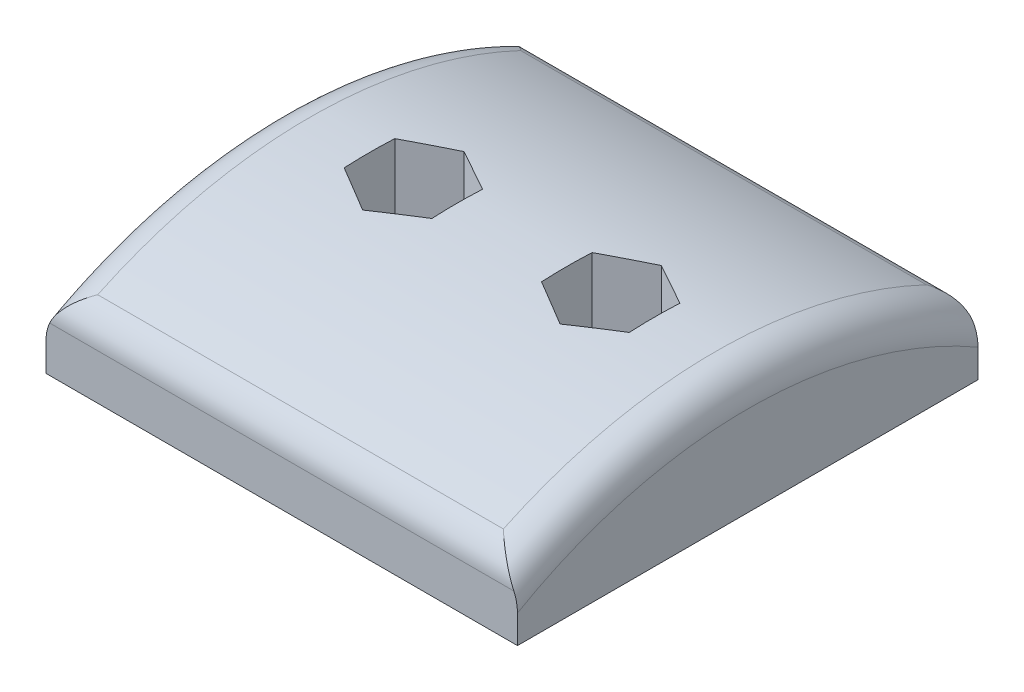
ISO-10303-21;
HEADER;
FILE_DESCRIPTION(('STEP AP214'),'2;1');
FILE_NAME('part.step','',(''),(''),'','','');
FILE_SCHEMA(('AUTOMOTIVE_DESIGN { 1 0 10303 214 1 1 1 1 }'));
ENDSEC;
DATA;
#1=APPLICATION_CONTEXT('core data for automotive mechanical design processes');
#2=APPLICATION_PROTOCOL_DEFINITION('international standard','automotive_design',2000,#1);
#3=PRODUCT_CONTEXT('',#1,'mechanical');
#4=PRODUCT('Part','Part','',(#3));
#5=PRODUCT_RELATED_PRODUCT_CATEGORY('part','',(#4));
#6=PRODUCT_DEFINITION_FORMATION('','',#4);
#7=PRODUCT_DEFINITION_CONTEXT('part definition',#1,'design');
#8=PRODUCT_DEFINITION('design','',#6,#7);
#9=PRODUCT_DEFINITION_SHAPE('','',#8);
#10=(LENGTH_UNIT() NAMED_UNIT(*) SI_UNIT(.MILLI.,.METRE.));
#11=(NAMED_UNIT(*) PLANE_ANGLE_UNIT() SI_UNIT($,.RADIAN.));
#12=(NAMED_UNIT(*) SI_UNIT($,.STERADIAN.) SOLID_ANGLE_UNIT());
#13=UNCERTAINTY_MEASURE_WITH_UNIT(LENGTH_MEASURE(1.E-05),#10,'distance_accuracy_value','');
#14=(GEOMETRIC_REPRESENTATION_CONTEXT(3) GLOBAL_UNCERTAINTY_ASSIGNED_CONTEXT((#13)) GLOBAL_UNIT_ASSIGNED_CONTEXT((#10,
#11,#12)) REPRESENTATION_CONTEXT('',''));
#15=CARTESIAN_POINT('',(0.,0.,0.));
#16=DIRECTION('',(0.,0.,1.));
#17=DIRECTION('',(1.,0.,0.));
#18=AXIS2_PLACEMENT_3D('',#15,#16,#17);
#19=CARTESIAN_POINT('',(21.5,-33.7994974842648,0.));
#20=DIRECTION('',(-1.,0.,0.));
#21=DIRECTION('',(0.,0.,1.));
#22=AXIS2_PLACEMENT_3D('',#19,#20,#21);
#23=CYLINDRICAL_SURFACE('',#22,45.);
#24=CARTESIAN_POINT('',(1.,-33.7994974842648,0.));
#25=DIRECTION('',(-0.5,0.,0.866025403784439));
#26=DIRECTION('',(-0.866025403784439,0.,-0.5));
#27=AXIS2_PLACEMENT_3D('',#24,#25,#26);
#28=ELLIPSE('',#27,90.,45.);
#29=CARTESIAN_POINT('',(9.,10.9628378733399,4.61880215351701));
#30=VERTEX_POINT('',#29);
#31=CARTESIAN_POINT('',(5.,11.1412041865666,2.3094010767585));
#32=VERTEX_POINT('',#31);
#33=EDGE_CURVE('E11',#30,#32,#28,.T.);
#34=ORIENTED_EDGE('',*,*,#33,.T.);
#35=CARTESIAN_POINT('',(5.,-33.7994974842648,0.));
#36=DIRECTION('',(-1.,0.,0.));
#37=DIRECTION('',(0.,0.,1.));
#38=AXIS2_PLACEMENT_3D('',#35,#36,#37);
#39=CIRCLE('',#38,45.);
#40=CARTESIAN_POINT('',(5.,11.1412041865666,-2.3094010767585));
#41=VERTEX_POINT('',#40);
#42=EDGE_CURVE('E176',#32,#41,#39,.T.);
#43=ORIENTED_EDGE('',*,*,#42,.T.);
#44=CARTESIAN_POINT('',(0.99999999999999,-33.7994974842648,0.));
#45=DIRECTION('',(-0.499999999999999,0.,-0.866025403784439));
#46=DIRECTION('',(-0.866025403784439,0.,0.499999999999999));
#47=AXIS2_PLACEMENT_3D('',#44,#45,#46);
#48=ELLIPSE('',#47,90.0000000000001,45.);
#49=CARTESIAN_POINT('',(9.,10.9628378733399,-4.618802153517));
#50=VERTEX_POINT('',#49);
#51=EDGE_CURVE('E353',#41,#50,#48,.T.);
#52=ORIENTED_EDGE('',*,*,#51,.T.);
#53=CARTESIAN_POINT('',(17.,-33.7994974842648,0.));
#54=DIRECTION('',(0.499999999999999,0.,-0.866025403784439));
#55=DIRECTION('',(-0.866025403784439,0.,-0.499999999999999));
#56=AXIS2_PLACEMENT_3D('',#53,#54,#55);
#57=ELLIPSE('',#56,90.0000000000001,45.);
#58=CARTESIAN_POINT('',(13.,11.1412041865666,-2.3094010767585));
#59=VERTEX_POINT('',#58);
#60=EDGE_CURVE('E356',#50,#59,#57,.T.);
#61=ORIENTED_EDGE('',*,*,#60,.T.);
#62=CARTESIAN_POINT('',(13.,-33.7994974842648,0.));
#63=DIRECTION('',(1.,0.,0.));
#64=DIRECTION('',(0.,0.,-1.));
#65=AXIS2_PLACEMENT_3D('',#62,#63,#64);
#66=CIRCLE('',#65,45.);
#67=CARTESIAN_POINT('',(13.,11.1412041865666,2.3094010767585));
#68=VERTEX_POINT('',#67);
#69=EDGE_CURVE('E359',#59,#68,#66,.T.);
#70=ORIENTED_EDGE('',*,*,#69,.T.);
#71=CARTESIAN_POINT('',(17.,-33.7994974842648,0.));
#72=DIRECTION('',(0.5,0.,0.866025403784439));
#73=DIRECTION('',(-0.866025403784439,0.,0.5));
#74=AXIS2_PLACEMENT_3D('',#71,#72,#73);
#75=ELLIPSE('',#74,90.,45.);
#76=EDGE_CURVE('E44',#68,#30,#75,.T.);
#77=ORIENTED_EDGE('',*,*,#76,.T.);
#78=EDGE_LOOP('',(#34,#43,#52,#61,#70,#77));
#79=FACE_BOUND('',#78,.T.);
#80=CARTESIAN_POINT('',(-17.,-33.7994974842648,0.));
#81=DIRECTION('',(-0.5,0.,0.866025403784439));
#82=DIRECTION('',(-0.866025403784439,0.,-0.5));
#83=AXIS2_PLACEMENT_3D('',#80,#81,#82);
#84=ELLIPSE('',#83,90.,45.);
#85=CARTESIAN_POINT('',(-9.,10.9628378733399,4.618802153517));
#86=VERTEX_POINT('',#85);
#87=CARTESIAN_POINT('',(-13.,11.1412041865666,2.3094010767585));
#88=VERTEX_POINT('',#87);
#89=EDGE_CURVE('E349',#86,#88,#84,.T.);
#90=ORIENTED_EDGE('',*,*,#89,.T.);
#91=CARTESIAN_POINT('',(-13.,-33.7994974842648,0.));
#92=DIRECTION('',(-1.,0.,0.));
#93=DIRECTION('',(0.,0.,1.));
#94=AXIS2_PLACEMENT_3D('',#91,#92,#93);
#95=CIRCLE('',#94,45.);
#96=CARTESIAN_POINT('',(-13.,11.1412041865666,-2.30940107675851));
#97=VERTEX_POINT('',#96);
#98=EDGE_CURVE('E333',#88,#97,#95,.T.);
#99=ORIENTED_EDGE('',*,*,#98,.T.);
#100=CARTESIAN_POINT('',(-17.,-33.7994974842648,0.));
#101=DIRECTION('',(-0.499999999999999,0.,-0.866025403784439));
#102=DIRECTION('',(-0.866025403784439,0.,0.499999999999999));
#103=AXIS2_PLACEMENT_3D('',#100,#101,#102);
#104=ELLIPSE('',#103,90.0000000000001,45.);
#105=CARTESIAN_POINT('',(-9.,10.9628378733399,-4.618802153517));
#106=VERTEX_POINT('',#105);
#107=EDGE_CURVE('E336',#97,#106,#104,.T.);
#108=ORIENTED_EDGE('',*,*,#107,.T.);
#109=CARTESIAN_POINT('',(-0.99999999999999,-33.7994974842648,0.));
#110=DIRECTION('',(0.5,0.,-0.866025403784439));
#111=DIRECTION('',(-0.866025403784439,0.,-0.5));
#112=AXIS2_PLACEMENT_3D('',#109,#110,#111);
#113=ELLIPSE('',#112,90.0000000000001,45.);
#114=CARTESIAN_POINT('',(-5.,11.1412041865666,-2.3094010767585));
#115=VERTEX_POINT('',#114);
#116=EDGE_CURVE('E340',#106,#115,#113,.T.);
#117=ORIENTED_EDGE('',*,*,#116,.T.);
#118=CARTESIAN_POINT('',(-5.,-33.7994974842648,0.));
#119=DIRECTION('',(1.,0.,0.));
#120=DIRECTION('',(0.,0.,-1.));
#121=AXIS2_PLACEMENT_3D('',#118,#119,#120);
#122=CIRCLE('',#121,45.);
#123=CARTESIAN_POINT('',(-5.,11.1412041865666,2.3094010767585));
#124=VERTEX_POINT('',#123);
#125=EDGE_CURVE('E343',#115,#124,#122,.T.);
#126=ORIENTED_EDGE('',*,*,#125,.T.);
#127=CARTESIAN_POINT('',(-1.,-33.7994974842648,0.));
#128=DIRECTION('',(0.5,0.,0.866025403784439));
#129=DIRECTION('',(-0.866025403784439,0.,0.5));
#130=AXIS2_PLACEMENT_3D('',#127,#128,#129);
#131=ELLIPSE('',#130,90.,45.);
#132=EDGE_CURVE('E346',#124,#86,#131,.T.);
#133=ORIENTED_EDGE('',*,*,#132,.T.);
#134=EDGE_LOOP('',(#90,#99,#108,#117,#126,#133));
#135=FACE_BOUND('',#134,.T.);
#136=CARTESIAN_POINT('',(18.5,-33.7994974842648,0.));
#137=DIRECTION('',(-1.,0.,0.));
#138=DIRECTION('',(0.,0.,1.));
#139=AXIS2_PLACEMENT_3D('',#136,#137,#138);
#140=CIRCLE('',#139,45.);
#141=CARTESIAN_POINT('',(18.5,6.8583581464715,19.2857142857143));
#142=VERTEX_POINT('',#141);
#143=CARTESIAN_POINT('',(18.5,6.8583581464715,-19.2857142857143));
#144=VERTEX_POINT('',#143);
#145=EDGE_CURVE('E272',#142,#144,#140,.T.);
#146=ORIENTED_EDGE('',*,*,#145,.T.);
#147=DIRECTION('',(-1.,0.,0.));
#148=VECTOR('',#147,1.);
#149=CARTESIAN_POINT('',(21.5,6.8583581464715,-19.2857142857143));
#150=LINE('',#149,#148);
#151=CARTESIAN_POINT('',(-18.5,6.8583581464715,-19.2857142857143));
#152=VERTEX_POINT('',#151);
#153=EDGE_CURVE('E274',#144,#152,#150,.T.);
#154=ORIENTED_EDGE('',*,*,#153,.T.);
#155=CARTESIAN_POINT('',(-18.5,-33.7994974842648,0.));
#156=DIRECTION('',(-1.,0.,0.));
#157=DIRECTION('',(0.,0.,1.));
#158=AXIS2_PLACEMENT_3D('',#155,#156,#157);
#159=CIRCLE('',#158,45.);
#160=CARTESIAN_POINT('',(-18.5,6.8583581464715,19.2857142857143));
#161=VERTEX_POINT('',#160);
#162=EDGE_CURVE('E268',#152,#161,#159,.F.);
#163=ORIENTED_EDGE('',*,*,#162,.T.);
#164=DIRECTION('',(-1.,0.,0.));
#165=VECTOR('',#164,1.);
#166=CARTESIAN_POINT('',(21.5,6.8583581464715,19.2857142857143));
#167=LINE('',#166,#165);
#168=EDGE_CURVE('E270',#161,#142,#167,.F.);
#169=ORIENTED_EDGE('',*,*,#168,.T.);
#170=EDGE_LOOP('',(#146,#154,#163,#169));
#171=FACE_BOUND('',#170,.T.);
#172=ADVANCED_FACE('F35',(#79,#135,#171),#23,.T.);
#173=CARTESIAN_POINT('',(21.5,6.,21.));
#174=DIRECTION('',(0.,0.,-1.));
#175=DIRECTION('',(-1.,0.,0.));
#176=AXIS2_PLACEMENT_3D('',#173,#174,#175);
#177=PLANE('',#176);
#178=DIRECTION('',(0.,-1.,0.));
#179=VECTOR('',#178,1.);
#180=CARTESIAN_POINT('',(21.5,6.,21.));
#181=LINE('',#180,#179);
#182=CARTESIAN_POINT('',(21.5,2.57356947468162,21.));
#183=VERTEX_POINT('',#182);
#184=CARTESIAN_POINT('',(21.5,0.,21.));
#185=VERTEX_POINT('',#184);
#186=EDGE_CURVE('E247',#183,#185,#181,.T.);
#187=ORIENTED_EDGE('',*,*,#186,.F.);
#188=CARTESIAN_POINT('',(21.5,2.57356947468162,21.));
#189=CARTESIAN_POINT('',(21.4999837214118,2.68242740250879,21.));
#190=CARTESIAN_POINT('',(21.4955518720459,2.79121056308361,21.));
#191=CARTESIAN_POINT('',(21.4777424726236,3.00814923270228,21.));
#192=CARTESIAN_POINT('',(21.464356005648,3.11630400761352,21.));
#193=CARTESIAN_POINT('',(21.4112890889158,3.43467998424908,21.));
#194=CARTESIAN_POINT('',(21.3587023326863,3.64301348052677,21.));
#195=CARTESIAN_POINT('',(21.271052064074,3.89618437613812,21.));
#196=CARTESIAN_POINT('',(21.2521994968675,3.94700561889606,21.));
#197=CARTESIAN_POINT('',(21.2121677568418,4.04799183232138,21.));
#198=CARTESIAN_POINT('',(21.1909783500522,4.09815274496904,21.));
#199=CARTESIAN_POINT('',(21.1686585187772,4.14783443775574,21.));
#200=B_SPLINE_CURVE_WITH_KNOTS('',3,(#188,#189,#190,#191,#192,#193,#194,#195,#196,#197,#198,
#199),.UNSPECIFIED.,.F.,.F.,(4,2,2,2,2,4),(0.,0.326329483090987,0.652984406544388,
1.29383335925713,1.45642064599622,1.61975058808437),.UNSPECIFIED.);
#201=CARTESIAN_POINT('',(21.1686585187772,4.14783443775574,21.));
#202=VERTEX_POINT('',#201);
#203=EDGE_CURVE('E402',#183,#202,#200,.T.);
#204=ORIENTED_EDGE('',*,*,#203,.T.);
#205=DIRECTION('',(-1.,0.,0.));
#206=VECTOR('',#205,1.);
#207=CARTESIAN_POINT('',(21.5,4.14783443775574,21.));
#208=LINE('',#207,#206);
#209=CARTESIAN_POINT('',(-21.1686585187772,4.14783443775574,21.));
#210=VERTEX_POINT('',#209);
#211=EDGE_CURVE('E407',#202,#210,#208,.T.);
#212=ORIENTED_EDGE('',*,*,#211,.T.);
#213=CARTESIAN_POINT('',(-21.1686585187772,4.14783443775574,21.));
#214=CARTESIAN_POINT('',(-21.2132789817724,4.04850140582036,21.));
#215=CARTESIAN_POINT('',(-21.2533803049916,3.94724843171625,21.));
#216=CARTESIAN_POINT('',(-21.324562056894,3.74160430443796,21.));
#217=CARTESIAN_POINT('',(-21.3556415552282,3.63721282883923,21.));
#218=CARTESIAN_POINT('',(-21.4344025753782,3.32422352628108,21.));
#219=CARTESIAN_POINT('',(-21.4692093064976,3.11217483255516,21.));
#220=CARTESIAN_POINT('',(-21.4911276131313,2.84508220447041,21.));
#221=CARTESIAN_POINT('',(-21.4944476629142,2.79098158331941,21.));
#222=CARTESIAN_POINT('',(-21.4988869042371,2.68245266489137,21.));
#223=CARTESIAN_POINT('',(-21.4999963920746,2.62802397029728,21.));
#224=CARTESIAN_POINT('',(-21.5,2.57356947468162,21.));
#225=B_SPLINE_CURVE_WITH_KNOTS('',3,(#213,#214,#215,#216,#217,#218,#219,#220,#221,#222,#223,
#224),.UNSPECIFIED.,.F.,.F.,(4,2,2,2,2,4),(0.,0.326386176587866,0.652805998834229,
1.29387258498216,1.45646077291456,1.61976111535798),.UNSPECIFIED.);
#226=CARTESIAN_POINT('',(-21.5,2.57356947468162,21.));
#227=VERTEX_POINT('',#226);
#228=EDGE_CURVE('E408',#210,#227,#225,.T.);
#229=ORIENTED_EDGE('',*,*,#228,.T.);
#230=DIRECTION('',(0.,-1.,0.));
#231=VECTOR('',#230,1.);
#232=CARTESIAN_POINT('',(-21.5,6.,21.));
#233=LINE('',#232,#231);
#234=CARTESIAN_POINT('',(-21.5,0.,21.));
#235=VERTEX_POINT('',#234);
#236=EDGE_CURVE('E256',#227,#235,#233,.T.);
#237=ORIENTED_EDGE('',*,*,#236,.T.);
#238=DIRECTION('',(-1.,0.,0.));
#239=VECTOR('',#238,1.);
#240=CARTESIAN_POINT('',(21.5,0.,21.));
#241=LINE('',#240,#239);
#242=EDGE_CURVE('E265',#185,#235,#241,.T.);
#243=ORIENTED_EDGE('',*,*,#242,.F.);
#244=EDGE_LOOP('',(#187,#204,#212,#229,#237,#243));
#245=FACE_BOUND('',#244,.T.);
#246=ADVANCED_FACE('F385',(#245),#177,.F.);
#247=CARTESIAN_POINT('',(21.5,0.,21.));
#248=DIRECTION('',(0.,1.,0.));
#249=DIRECTION('',(0.,0.,1.));
#250=AXIS2_PLACEMENT_3D('',#247,#248,#249);
#251=PLANE('',#250);
#252=CARTESIAN_POINT('',(-9.,0.,0.));
#253=DIRECTION('',(0.,-1.,0.));
#254=DIRECTION('',(0.,0.,-1.));
#255=AXIS2_PLACEMENT_3D('',#252,#253,#254);
#256=CIRCLE('',#255,2.5);
#257=CARTESIAN_POINT('',(-9.,0.,-2.5));
#258=VERTEX_POINT('',#257);
#259=EDGE_CURVE('E449',#258,#258,#256,.T.);
#260=ORIENTED_EDGE('',*,*,#259,.F.);
#261=EDGE_LOOP('',(#260));
#262=FACE_BOUND('',#261,.T.);
#263=CARTESIAN_POINT('',(9.,0.,0.));
#264=DIRECTION('',(0.,-1.,0.));
#265=DIRECTION('',(0.,0.,-1.));
#266=AXIS2_PLACEMENT_3D('',#263,#264,#265);
#267=CIRCLE('',#266,2.5);
#268=CARTESIAN_POINT('',(9.,0.,-2.5));
#269=VERTEX_POINT('',#268);
#270=EDGE_CURVE('E198',#269,#269,#267,.T.);
#271=ORIENTED_EDGE('',*,*,#270,.F.);
#272=EDGE_LOOP('',(#271));
#273=FACE_BOUND('',#272,.T.);
#274=DIRECTION('',(0.,0.,-1.));
#275=VECTOR('',#274,1.);
#276=CARTESIAN_POINT('',(-21.5,0.,21.));
#277=LINE('',#276,#275);
#278=CARTESIAN_POINT('',(-21.5,0.,-21.));
#279=VERTEX_POINT('',#278);
#280=EDGE_CURVE('E258',#235,#279,#277,.T.);
#281=ORIENTED_EDGE('',*,*,#280,.T.);
#282=DIRECTION('',(-1.,0.,0.));
#283=VECTOR('',#282,1.);
#284=CARTESIAN_POINT('',(21.5,0.,-21.));
#285=LINE('',#284,#283);
#286=CARTESIAN_POINT('',(21.5,0.,-21.));
#287=VERTEX_POINT('',#286);
#288=EDGE_CURVE('E255',#287,#279,#285,.T.);
#289=ORIENTED_EDGE('',*,*,#288,.F.);
#290=DIRECTION('',(0.,0.,-1.));
#291=VECTOR('',#290,1.);
#292=CARTESIAN_POINT('',(21.5,0.,21.));
#293=LINE('',#292,#291);
#294=EDGE_CURVE('E249',#185,#287,#293,.T.);
#295=ORIENTED_EDGE('',*,*,#294,.F.);
#296=ORIENTED_EDGE('',*,*,#242,.T.);
#297=EDGE_LOOP('',(#281,#289,#295,#296));
#298=FACE_BOUND('',#297,.T.);
#299=ADVANCED_FACE('F295',(#262,#273,#298),#251,.F.);
#300=CARTESIAN_POINT('',(21.5,0.,-21.));
#301=DIRECTION('',(0.,0.,1.));
#302=DIRECTION('',(1.,0.,0.));
#303=AXIS2_PLACEMENT_3D('',#300,#301,#302);
#304=PLANE('',#303);
#305=DIRECTION('',(-1.,0.,0.));
#306=VECTOR('',#305,1.);
#307=CARTESIAN_POINT('',(21.5,4.14783443775574,-21.));
#308=LINE('',#307,#306);
#309=CARTESIAN_POINT('',(-21.1686585187772,4.14783443775574,-21.));
#310=VERTEX_POINT('',#309);
#311=CARTESIAN_POINT('',(21.1686585187772,4.14783443775574,-21.));
#312=VERTEX_POINT('',#311);
#313=EDGE_CURVE('E284',#310,#312,#308,.F.);
#314=ORIENTED_EDGE('',*,*,#313,.T.);
#315=CARTESIAN_POINT('',(21.1686585187772,4.14783443775574,-21.));
#316=CARTESIAN_POINT('',(21.2132789817724,4.04850140582036,-21.));
#317=CARTESIAN_POINT('',(21.2533803049916,3.94724843171625,-21.));
#318=CARTESIAN_POINT('',(21.324562056894,3.74160430443797,-21.));
#319=CARTESIAN_POINT('',(21.3556415552282,3.63721282883924,-21.));
#320=CARTESIAN_POINT('',(21.4344025753782,3.32422352628109,-21.));
#321=CARTESIAN_POINT('',(21.4692093064976,3.11217483255516,-21.));
#322=CARTESIAN_POINT('',(21.4911276131313,2.84508220447042,-21.));
#323=CARTESIAN_POINT('',(21.4944476629142,2.79098158331941,-21.));
#324=CARTESIAN_POINT('',(21.4988869042372,2.68245266489138,-21.));
#325=CARTESIAN_POINT('',(21.4999963920746,2.62802397029728,-21.));
#326=CARTESIAN_POINT('',(21.5,2.57356947468162,-21.));
#327=B_SPLINE_CURVE_WITH_KNOTS('',3,(#315,#316,#317,#318,#319,#320,#321,#322,#323,#324,#325,
#326),.UNSPECIFIED.,.F.,.F.,(4,2,2,2,2,4),(0.,0.326386176587865,0.652805998834226,
1.29387258498216,1.45646077291455,1.61976111535798),.UNSPECIFIED.);
#328=CARTESIAN_POINT('',(21.5,2.57356947468162,-21.));
#329=VERTEX_POINT('',#328);
#330=EDGE_CURVE('E301',#312,#329,#327,.T.);
#331=ORIENTED_EDGE('',*,*,#330,.T.);
#332=DIRECTION('',(0.,1.,0.));
#333=VECTOR('',#332,1.);
#334=CARTESIAN_POINT('',(21.5,0.,-21.));
#335=LINE('',#334,#333);
#336=EDGE_CURVE('E252',#287,#329,#335,.T.);
#337=ORIENTED_EDGE('',*,*,#336,.F.);
#338=ORIENTED_EDGE('',*,*,#288,.T.);
#339=DIRECTION('',(0.,1.,0.));
#340=VECTOR('',#339,1.);
#341=CARTESIAN_POINT('',(-21.5,0.,-21.));
#342=LINE('',#341,#340);
#343=CARTESIAN_POINT('',(-21.5,2.57356947468162,-21.));
#344=VERTEX_POINT('',#343);
#345=EDGE_CURVE('E250',#279,#344,#342,.T.);
#346=ORIENTED_EDGE('',*,*,#345,.T.);
#347=CARTESIAN_POINT('',(-21.5,2.57356947468162,-21.));
#348=CARTESIAN_POINT('',(-21.4999837214118,2.68242740250879,-21.));
#349=CARTESIAN_POINT('',(-21.4955518720459,2.79121056308361,-21.));
#350=CARTESIAN_POINT('',(-21.4777424726236,3.00814923270228,-21.));
#351=CARTESIAN_POINT('',(-21.464356005648,3.11630400761352,-21.));
#352=CARTESIAN_POINT('',(-21.4112890889158,3.43467998424908,-21.));
#353=CARTESIAN_POINT('',(-21.3587023326863,3.64301348052677,-21.));
#354=CARTESIAN_POINT('',(-21.271052064074,3.89618437613812,-21.));
#355=CARTESIAN_POINT('',(-21.2521994968675,3.94700561889606,-21.));
#356=CARTESIAN_POINT('',(-21.2121677568418,4.04799183232138,-21.));
#357=CARTESIAN_POINT('',(-21.1909783500522,4.09815274496904,-21.));
#358=CARTESIAN_POINT('',(-21.1686585187772,4.14783443775574,-21.));
#359=B_SPLINE_CURVE_WITH_KNOTS('',3,(#347,#348,#349,#350,#351,#352,#353,#354,#355,#356,#357,
#358),.UNSPECIFIED.,.F.,.F.,(4,2,2,2,2,4),(0.,0.326329483090986,0.652984406544387,
1.29383335925712,1.45642064599622,1.61975058808436),.UNSPECIFIED.);
#360=EDGE_CURVE('E277',#344,#310,#359,.T.);
#361=ORIENTED_EDGE('',*,*,#360,.T.);
#362=EDGE_LOOP('',(#314,#331,#337,#338,#346,#361));
#363=FACE_BOUND('',#362,.T.);
#364=ADVANCED_FACE('F289',(#363),#304,.F.);
#365=CARTESIAN_POINT('',(21.5,-33.7994974842648,0.));
#366=DIRECTION('',(-1.,0.,0.));
#367=DIRECTION('',(0.,0.,1.));
#368=AXIS2_PLACEMENT_3D('',#365,#366,#367);
#369=PLANE('',#368);
#370=ORIENTED_EDGE('',*,*,#336,.T.);
#371=CARTESIAN_POINT('',(21.5,-33.7994974842648,0.));
#372=DIRECTION('',(-1.,0.,0.));
#373=DIRECTION('',(0.,0.,1.));
#374=AXIS2_PLACEMENT_3D('',#371,#372,#373);
#375=CIRCLE('',#374,42.);
#376=EDGE_CURVE('E306',#329,#183,#375,.F.);
#377=ORIENTED_EDGE('',*,*,#376,.T.);
#378=ORIENTED_EDGE('',*,*,#186,.T.);
#379=ORIENTED_EDGE('',*,*,#294,.T.);
#380=EDGE_LOOP('',(#370,#377,#378,#379));
#381=FACE_BOUND('',#380,.T.);
#382=ADVANCED_FACE('F294',(#381),#369,.F.);
#383=CARTESIAN_POINT('',(-21.5,-33.7994974842648,0.));
#384=DIRECTION('',(-1.,0.,0.));
#385=DIRECTION('',(0.,0.,1.));
#386=AXIS2_PLACEMENT_3D('',#383,#384,#385);
#387=PLANE('',#386);
#388=ORIENTED_EDGE('',*,*,#236,.F.);
#389=CARTESIAN_POINT('',(-21.5,-33.7994974842648,0.));
#390=DIRECTION('',(-1.,0.,0.));
#391=DIRECTION('',(0.,0.,1.));
#392=AXIS2_PLACEMENT_3D('',#389,#390,#391);
#393=CIRCLE('',#392,42.);
#394=EDGE_CURVE('E337',#227,#344,#393,.T.);
#395=ORIENTED_EDGE('',*,*,#394,.T.);
#396=ORIENTED_EDGE('',*,*,#345,.F.);
#397=ORIENTED_EDGE('',*,*,#280,.F.);
#398=EDGE_LOOP('',(#388,#395,#396,#397));
#399=FACE_BOUND('',#398,.T.);
#400=ADVANCED_FACE('F297',(#399),#387,.T.);
#401=CARTESIAN_POINT('',(21.5,4.14783443775574,18.));
#402=DIRECTION('',(-1.,0.,0.));
#403=DIRECTION('',(0.,0.,1.));
#404=AXIS2_PLACEMENT_3D('',#401,#402,#403);
#405=CYLINDRICAL_SURFACE('',#404,3.);
#406=CARTESIAN_POINT('',(-21.1686585187772,4.14783443775574,21.));
#407=CARTESIAN_POINT('',(-21.1277212455963,4.23892402609789,20.9999941131997));
#408=CARTESIAN_POINT('',(-21.0839227165948,4.32859506284557,20.9958528464613));
#409=CARTESIAN_POINT('',(-20.9914997714861,4.50452236845445,20.9800277627855));
#410=CARTESIAN_POINT('',(-20.9428847408705,4.59078483747886,20.9683583797387));
#411=CARTESIAN_POINT('',(-20.791848512228,4.8425325084541,20.9234022977827));
#412=CARTESIAN_POINT('',(-20.6834415995071,5.00269158893433,20.8801395694655));
#413=CARTESIAN_POINT('',(-20.4238380615464,5.34923509124577,20.7566921668865));
#414=CARTESIAN_POINT('',(-20.2691483945678,5.53044526832324,20.6695690019695));
#415=CARTESIAN_POINT('',(-19.9480241573472,5.86593334311525,20.4671225313336));
#416=CARTESIAN_POINT('',(-19.7815358567875,6.02007521813774,20.3516634190559));
#417=CARTESIAN_POINT('',(-19.4322445004268,6.30813521279827,20.0911655527539));
#418=CARTESIAN_POINT('',(-19.2490545780837,6.44037053387554,19.944803294452));
#419=CARTESIAN_POINT('',(-18.8797858226115,6.67222456452165,19.63251726636));
#420=CARTESIAN_POINT('',(-18.6937173479585,6.77194027701992,19.4666537188333));
#421=CARTESIAN_POINT('',(-18.5052522099677,6.85602485399884,19.290624670352));
#422=CARTESIAN_POINT('',(-18.502626079327,6.85719317906296,19.2881702449657));
#423=CARTESIAN_POINT('',(-18.5,6.8583581464715,19.2857142857143));
#424=B_SPLINE_CURVE_WITH_KNOTS('',3,(#406,#407,#408,#409,#410,#411,#412,#413,#414,#415,#416,
#417,#418,#419,#420,#421,#422,#423),.UNSPECIFIED.,.F.,.F.,(4,2,2,2,2,2,2,2,4),(0.,
0.29926971800619,0.597967335444325,1.1897801463482,1.9469350644829,2.70779222564909,
3.51260497114431,4.31499459811864,4.32633353772624),.UNSPECIFIED.);
#425=EDGE_CURVE('E329',#210,#161,#424,.T.);
#426=ORIENTED_EDGE('',*,*,#425,.F.);
#427=ORIENTED_EDGE('',*,*,#211,.F.);
#428=CARTESIAN_POINT('',(21.1686585187772,4.14783443775574,21.));
#429=CARTESIAN_POINT('',(21.1277212455963,4.23892402609789,20.9999941131997));
#430=CARTESIAN_POINT('',(21.0839227165948,4.32859506284557,20.9958528464613));
#431=CARTESIAN_POINT('',(20.9914997714861,4.50452236845445,20.9800277627855));
#432=CARTESIAN_POINT('',(20.9428847408705,4.59078483747887,20.9683583797387));
#433=CARTESIAN_POINT('',(20.791848512228,4.84253250845411,20.9234022977827));
#434=CARTESIAN_POINT('',(20.6834415995071,5.00269158893433,20.8801395694655));
#435=CARTESIAN_POINT('',(20.4238380615464,5.34923509124576,20.7566921668865));
#436=CARTESIAN_POINT('',(20.2691483945678,5.53044526832324,20.6695690019695));
#437=CARTESIAN_POINT('',(19.9480241573472,5.86593334311525,20.4671225313336));
#438=CARTESIAN_POINT('',(19.7815358567875,6.02007521813774,20.3516634190559));
#439=CARTESIAN_POINT('',(19.4322445004268,6.30813521279826,20.0911655527539));
#440=CARTESIAN_POINT('',(19.2490545780837,6.44037053387554,19.944803294452));
#441=CARTESIAN_POINT('',(18.8797858226115,6.67222456452164,19.63251726636));
#442=CARTESIAN_POINT('',(18.6937173479586,6.77194027701992,19.4666537188333));
#443=CARTESIAN_POINT('',(18.5052522099677,6.85602485399884,19.290624670352));
#444=CARTESIAN_POINT('',(18.502626079327,6.85719317906296,19.2881702449657));
#445=CARTESIAN_POINT('',(18.5,6.8583581464715,19.2857142857143));
#446=B_SPLINE_CURVE_WITH_KNOTS('',3,(#428,#429,#430,#431,#432,#433,#434,#435,#436,#437,#438,
#439,#440,#441,#442,#443,#444,#445),.UNSPECIFIED.,.F.,.F.,(4,2,2,2,2,2,2,2,4),(0.,
0.299269718006191,0.597967335444328,1.1897801463482,1.9469350644829,2.70779222564909,
3.51260497114431,4.31499459811864,4.32633353772624),.UNSPECIFIED.);
#447=EDGE_CURVE('E259',#142,#202,#446,.F.);
#448=ORIENTED_EDGE('',*,*,#447,.F.);
#449=ORIENTED_EDGE('',*,*,#168,.F.);
#450=EDGE_LOOP('',(#426,#427,#448,#449));
#451=FACE_BOUND('',#450,.T.);
#452=ADVANCED_FACE('F37',(#451),#405,.T.);
#453=CARTESIAN_POINT('',(18.5,-33.7994974842648,0.));
#454=DIRECTION('',(-1.,0.,0.));
#455=DIRECTION('',(0.,0.,1.));
#456=AXIS2_PLACEMENT_3D('',#453,#454,#455);
#457=TOROIDAL_SURFACE('',#456,42.,3.);
#458=ORIENTED_EDGE('',*,*,#376,.F.);
#459=ORIENTED_EDGE('',*,*,#330,.F.);
#460=CARTESIAN_POINT('',(21.1686585187772,4.14783443775574,-21.));
#461=CARTESIAN_POINT('',(21.1277212455963,4.23892402609789,-20.9999941131997));
#462=CARTESIAN_POINT('',(21.0839227165948,4.32859506284557,-20.9958528464613));
#463=CARTESIAN_POINT('',(20.9914997714861,4.50452236845445,-20.9800277627855));
#464=CARTESIAN_POINT('',(20.9428847408705,4.59078483747887,-20.9683583797387));
#465=CARTESIAN_POINT('',(20.791848512228,4.84253250845411,-20.9234022977827));
#466=CARTESIAN_POINT('',(20.6834415995071,5.00269158893433,-20.8801395694655));
#467=CARTESIAN_POINT('',(20.4238380615464,5.34923509124576,-20.7566921668865));
#468=CARTESIAN_POINT('',(20.2691483945678,5.53044526832324,-20.6695690019695));
#469=CARTESIAN_POINT('',(19.9480241573472,5.86593334311525,-20.4671225313336));
#470=CARTESIAN_POINT('',(19.7815358567875,6.02007521813774,-20.3516634190559));
#471=CARTESIAN_POINT('',(19.4322445004268,6.30813521279826,-20.0911655527539));
#472=CARTESIAN_POINT('',(19.2490545780837,6.44037053387554,-19.944803294452));
#473=CARTESIAN_POINT('',(18.8797858226115,6.67222456452164,-19.63251726636));
#474=CARTESIAN_POINT('',(18.6937173479586,6.77194027701992,-19.4666537188333));
#475=CARTESIAN_POINT('',(18.5052522099677,6.85602485399884,-19.290624670352));
#476=CARTESIAN_POINT('',(18.502626079327,6.85719317906296,-19.2881702449657));
#477=CARTESIAN_POINT('',(18.5,6.8583581464715,-19.2857142857143));
#478=B_SPLINE_CURVE_WITH_KNOTS('',3,(#460,#461,#462,#463,#464,#465,#466,#467,#468,#469,#470,
#471,#472,#473,#474,#475,#476,#477),.UNSPECIFIED.,.F.,.F.,(4,2,2,2,2,2,2,2,4),(0.,
0.299269718006191,0.597967335444328,1.1897801463482,1.9469350644829,2.70779222564909,
3.51260497114431,4.31499459811864,4.32633353772624),.UNSPECIFIED.);
#479=EDGE_CURVE('E315',#144,#312,#478,.F.);
#480=ORIENTED_EDGE('',*,*,#479,.F.);
#481=ORIENTED_EDGE('',*,*,#145,.F.);
#482=ORIENTED_EDGE('',*,*,#447,.T.);
#483=ORIENTED_EDGE('',*,*,#203,.F.);
#484=EDGE_LOOP('',(#458,#459,#480,#481,#482,#483));
#485=FACE_BOUND('',#484,.T.);
#486=ADVANCED_FACE('F308',(#485),#457,.T.);
#487=CARTESIAN_POINT('',(-18.5,-33.7994974842648,0.));
#488=DIRECTION('',(-1.,0.,0.));
#489=DIRECTION('',(0.,0.,1.));
#490=AXIS2_PLACEMENT_3D('',#487,#488,#489);
#491=TOROIDAL_SURFACE('',#490,42.,3.);
#492=ORIENTED_EDGE('',*,*,#425,.T.);
#493=ORIENTED_EDGE('',*,*,#162,.F.);
#494=CARTESIAN_POINT('',(-21.1686585187772,4.14783443775574,-21.));
#495=CARTESIAN_POINT('',(-21.1277212455963,4.23892402609789,-20.9999941131997));
#496=CARTESIAN_POINT('',(-21.0839227165948,4.32859506284557,-20.9958528464613));
#497=CARTESIAN_POINT('',(-20.9914997714861,4.50452236845445,-20.9800277627855));
#498=CARTESIAN_POINT('',(-20.9428847408705,4.59078483747886,-20.9683583797387));
#499=CARTESIAN_POINT('',(-20.791848512228,4.8425325084541,-20.9234022977827));
#500=CARTESIAN_POINT('',(-20.6834415995071,5.00269158893433,-20.8801395694655));
#501=CARTESIAN_POINT('',(-20.4238380615464,5.34923509124577,-20.7566921668865));
#502=CARTESIAN_POINT('',(-20.2691483945678,5.53044526832324,-20.6695690019695));
#503=CARTESIAN_POINT('',(-19.9480241573472,5.86593334311525,-20.4671225313336));
#504=CARTESIAN_POINT('',(-19.7815358567875,6.02007521813774,-20.3516634190559));
#505=CARTESIAN_POINT('',(-19.4322445004268,6.30813521279827,-20.0911655527539));
#506=CARTESIAN_POINT('',(-19.2490545780837,6.44037053387554,-19.944803294452));
#507=CARTESIAN_POINT('',(-18.8797858226115,6.67222456452165,-19.63251726636));
#508=CARTESIAN_POINT('',(-18.6937173479585,6.77194027701992,-19.4666537188333));
#509=CARTESIAN_POINT('',(-18.5052522099677,6.85602485399884,-19.290624670352));
#510=CARTESIAN_POINT('',(-18.502626079327,6.85719317906296,-19.2881702449657));
#511=CARTESIAN_POINT('',(-18.5,6.8583581464715,-19.2857142857143));
#512=B_SPLINE_CURVE_WITH_KNOTS('',3,(#494,#495,#496,#497,#498,#499,#500,#501,#502,#503,#504,
#505,#506,#507,#508,#509,#510,#511),.UNSPECIFIED.,.F.,.F.,(4,2,2,2,2,2,2,2,4),(0.,
0.29926971800619,0.597967335444325,1.1897801463482,1.9469350644829,2.70779222564909,
3.51260497114431,4.31499459811864,4.32633353772624),.UNSPECIFIED.);
#513=EDGE_CURVE('E238',#310,#152,#512,.T.);
#514=ORIENTED_EDGE('',*,*,#513,.F.);
#515=ORIENTED_EDGE('',*,*,#360,.F.);
#516=ORIENTED_EDGE('',*,*,#394,.F.);
#517=ORIENTED_EDGE('',*,*,#228,.F.);
#518=EDGE_LOOP('',(#492,#493,#514,#515,#516,#517));
#519=FACE_BOUND('',#518,.T.);
#520=ADVANCED_FACE('F286',(#519),#491,.T.);
#521=CARTESIAN_POINT('',(21.5,4.14783443775574,-18.));
#522=DIRECTION('',(-1.,0.,0.));
#523=DIRECTION('',(0.,0.,1.));
#524=AXIS2_PLACEMENT_3D('',#521,#522,#523);
#525=CYLINDRICAL_SURFACE('',#524,3.);
#526=ORIENTED_EDGE('',*,*,#479,.T.);
#527=ORIENTED_EDGE('',*,*,#313,.F.);
#528=ORIENTED_EDGE('',*,*,#513,.T.);
#529=ORIENTED_EDGE('',*,*,#153,.F.);
#530=EDGE_LOOP('',(#526,#527,#528,#529));
#531=FACE_BOUND('',#530,.T.);
#532=ADVANCED_FACE('F392',(#531),#525,.T.);
#533=CARTESIAN_POINT('',(-13.,11.2005025157352,2.3094010767585));
#534=DIRECTION('',(-0.5,0.,0.866025403784439));
#535=DIRECTION('',(0.866025403784439,0.,0.5));
#536=AXIS2_PLACEMENT_3D('',#533,#534,#535);
#537=PLANE('',#536);
#538=DIRECTION('',(0.,-1.,0.));
#539=VECTOR('',#538,1.);
#540=CARTESIAN_POINT('',(-9.,11.2005025157352,4.618802153517));
#541=LINE('',#540,#539);
#542=CARTESIAN_POINT('',(-9.,4.,4.618802153517));
#543=VERTEX_POINT('',#542);
#544=EDGE_CURVE('E236',#86,#543,#541,.T.);
#545=ORIENTED_EDGE('',*,*,#544,.T.);
#546=DIRECTION('',(-0.866025403784439,0.,-0.5));
#547=VECTOR('',#546,1.);
#548=CARTESIAN_POINT('',(-13.,4.,2.3094010767585));
#549=LINE('',#548,#547);
#550=CARTESIAN_POINT('',(-13.,4.,2.3094010767585));
#551=VERTEX_POINT('',#550);
#552=EDGE_CURVE('E211',#543,#551,#549,.T.);
#553=ORIENTED_EDGE('',*,*,#552,.T.);
#554=DIRECTION('',(0.,-1.,0.));
#555=VECTOR('',#554,1.);
#556=CARTESIAN_POINT('',(-13.,11.2005025157352,2.3094010767585));
#557=LINE('',#556,#555);
#558=EDGE_CURVE('E235',#88,#551,#557,.T.);
#559=ORIENTED_EDGE('',*,*,#558,.F.);
#560=ORIENTED_EDGE('',*,*,#89,.F.);
#561=EDGE_LOOP('',(#545,#553,#559,#560));
#562=FACE_BOUND('',#561,.T.);
#563=ADVANCED_FACE('F395',(#562),#537,.F.);
#564=CARTESIAN_POINT('',(-9.,11.2005025157352,4.618802153517));
#565=DIRECTION('',(0.5,0.,0.866025403784439));
#566=DIRECTION('',(0.866025403784439,0.,-0.5));
#567=AXIS2_PLACEMENT_3D('',#564,#565,#566);
#568=PLANE('',#567);
#569=DIRECTION('',(0.,-1.,0.));
#570=VECTOR('',#569,1.);
#571=CARTESIAN_POINT('',(-5.,11.2005025157352,2.3094010767585));
#572=LINE('',#571,#570);
#573=CARTESIAN_POINT('',(-5.,4.,2.3094010767585));
#574=VERTEX_POINT('',#573);
#575=EDGE_CURVE('E239',#124,#574,#572,.T.);
#576=ORIENTED_EDGE('',*,*,#575,.T.);
#577=DIRECTION('',(-0.866025403784439,0.,0.5));
#578=VECTOR('',#577,1.);
#579=CARTESIAN_POINT('',(-9.,4.,4.618802153517));
#580=LINE('',#579,#578);
#581=EDGE_CURVE('E232',#574,#543,#580,.T.);
#582=ORIENTED_EDGE('',*,*,#581,.T.);
#583=ORIENTED_EDGE('',*,*,#544,.F.);
#584=ORIENTED_EDGE('',*,*,#132,.F.);
#585=EDGE_LOOP('',(#576,#582,#583,#584));
#586=FACE_BOUND('',#585,.T.);
#587=ADVANCED_FACE('F579',(#586),#568,.F.);
#588=CARTESIAN_POINT('',(-5.,11.2005025157352,2.3094010767585));
#589=DIRECTION('',(1.,0.,0.));
#590=DIRECTION('',(0.,0.,-1.));
#591=AXIS2_PLACEMENT_3D('',#588,#589,#590);
#592=PLANE('',#591);
#593=DIRECTION('',(0.,-1.,0.));
#594=VECTOR('',#593,1.);
#595=CARTESIAN_POINT('',(-5.,11.2005025157352,-2.3094010767585));
#596=LINE('',#595,#594);
#597=CARTESIAN_POINT('',(-5.,4.,-2.3094010767585));
#598=VERTEX_POINT('',#597);
#599=EDGE_CURVE('E241',#115,#598,#596,.T.);
#600=ORIENTED_EDGE('',*,*,#599,.T.);
#601=DIRECTION('',(0.,0.,1.));
#602=VECTOR('',#601,1.);
#603=CARTESIAN_POINT('',(-5.,4.,2.3094010767585));
#604=LINE('',#603,#602);
#605=EDGE_CURVE('E229',#598,#574,#604,.T.);
#606=ORIENTED_EDGE('',*,*,#605,.T.);
#607=ORIENTED_EDGE('',*,*,#575,.F.);
#608=ORIENTED_EDGE('',*,*,#125,.F.);
#609=EDGE_LOOP('',(#600,#606,#607,#608));
#610=FACE_BOUND('',#609,.T.);
#611=ADVANCED_FACE('F569',(#610),#592,.F.);
#612=CARTESIAN_POINT('',(-5.,11.2005025157352,-2.3094010767585));
#613=DIRECTION('',(0.5,0.,-0.866025403784439));
#614=DIRECTION('',(-0.866025403784439,0.,-0.5));
#615=AXIS2_PLACEMENT_3D('',#612,#613,#614);
#616=PLANE('',#615);
#617=DIRECTION('',(0.,-1.,0.));
#618=VECTOR('',#617,1.);
#619=CARTESIAN_POINT('',(-9.,11.2005025157352,-4.618802153517));
#620=LINE('',#619,#618);
#621=CARTESIAN_POINT('',(-9.,4.,-4.618802153517));
#622=VERTEX_POINT('',#621);
#623=EDGE_CURVE('E243',#106,#622,#620,.T.);
#624=ORIENTED_EDGE('',*,*,#623,.T.);
#625=DIRECTION('',(0.866025403784439,0.,0.5));
#626=VECTOR('',#625,1.);
#627=CARTESIAN_POINT('',(-5.,4.,-2.3094010767585));
#628=LINE('',#627,#626);
#629=EDGE_CURVE('E226',#622,#598,#628,.T.);
#630=ORIENTED_EDGE('',*,*,#629,.T.);
#631=ORIENTED_EDGE('',*,*,#599,.F.);
#632=ORIENTED_EDGE('',*,*,#116,.F.);
#633=EDGE_LOOP('',(#624,#630,#631,#632));
#634=FACE_BOUND('',#633,.T.);
#635=ADVANCED_FACE('F559',(#634),#616,.F.);
#636=CARTESIAN_POINT('',(-9.,11.2005025157352,-4.618802153517));
#637=DIRECTION('',(-0.499999999999999,0.,-0.866025403784439));
#638=DIRECTION('',(-0.866025403784439,0.,0.499999999999999));
#639=AXIS2_PLACEMENT_3D('',#636,#637,#638);
#640=PLANE('',#639);
#641=DIRECTION('',(0.,-1.,0.));
#642=VECTOR('',#641,1.);
#643=CARTESIAN_POINT('',(-13.,11.2005025157352,-2.30940107675851));
#644=LINE('',#643,#642);
#645=CARTESIAN_POINT('',(-13.,4.,-2.30940107675851));
#646=VERTEX_POINT('',#645);
#647=EDGE_CURVE('E59',#97,#646,#644,.T.);
#648=ORIENTED_EDGE('',*,*,#647,.T.);
#649=DIRECTION('',(0.866025403784439,0.,-0.499999999999999));
#650=VECTOR('',#649,1.);
#651=CARTESIAN_POINT('',(-9.,4.,-4.618802153517));
#652=LINE('',#651,#650);
#653=EDGE_CURVE('E223',#646,#622,#652,.T.);
#654=ORIENTED_EDGE('',*,*,#653,.T.);
#655=ORIENTED_EDGE('',*,*,#623,.F.);
#656=ORIENTED_EDGE('',*,*,#107,.F.);
#657=EDGE_LOOP('',(#648,#654,#655,#656));
#658=FACE_BOUND('',#657,.T.);
#659=ADVANCED_FACE('F552',(#658),#640,.F.);
#660=CARTESIAN_POINT('',(-13.,11.2005025157352,-2.30940107675851));
#661=DIRECTION('',(-1.,0.,0.));
#662=DIRECTION('',(0.,0.,1.));
#663=AXIS2_PLACEMENT_3D('',#660,#661,#662);
#664=PLANE('',#663);
#665=ORIENTED_EDGE('',*,*,#558,.T.);
#666=DIRECTION('',(0.,0.,-1.));
#667=VECTOR('',#666,1.);
#668=CARTESIAN_POINT('',(-13.,4.,-2.30940107675851));
#669=LINE('',#668,#667);
#670=EDGE_CURVE('E221',#551,#646,#669,.T.);
#671=ORIENTED_EDGE('',*,*,#670,.T.);
#672=ORIENTED_EDGE('',*,*,#647,.F.);
#673=ORIENTED_EDGE('',*,*,#98,.F.);
#674=EDGE_LOOP('',(#665,#671,#672,#673));
#675=FACE_BOUND('',#674,.T.);
#676=ADVANCED_FACE('F513',(#675),#664,.F.);
#677=CARTESIAN_POINT('',(0.,4.,0.));
#678=DIRECTION('',(0.,1.,0.));
#679=DIRECTION('',(0.,0.,1.));
#680=AXIS2_PLACEMENT_3D('',#677,#678,#679);
#681=PLANE('',#680);
#682=CARTESIAN_POINT('',(-9.,4.,0.));
#683=DIRECTION('',(0.,-1.,0.));
#684=DIRECTION('',(0.,0.,-1.));
#685=AXIS2_PLACEMENT_3D('',#682,#683,#684);
#686=CIRCLE('',#685,2.5);
#687=CARTESIAN_POINT('',(-9.,4.,-2.5));
#688=VERTEX_POINT('',#687);
#689=EDGE_CURVE('E453',#688,#688,#686,.T.);
#690=ORIENTED_EDGE('',*,*,#689,.T.);
#691=EDGE_LOOP('',(#690));
#692=FACE_BOUND('',#691,.T.);
#693=ORIENTED_EDGE('',*,*,#552,.F.);
#694=ORIENTED_EDGE('',*,*,#581,.F.);
#695=ORIENTED_EDGE('',*,*,#605,.F.);
#696=ORIENTED_EDGE('',*,*,#629,.F.);
#697=ORIENTED_EDGE('',*,*,#653,.F.);
#698=ORIENTED_EDGE('',*,*,#670,.F.);
#699=EDGE_LOOP('',(#693,#694,#695,#696,#697,#698));
#700=FACE_BOUND('',#699,.T.);
#701=ADVANCED_FACE('F508',(#692,#700),#681,.T.);
#702=CARTESIAN_POINT('',(9.,11.2005025157352,4.61880215351701));
#703=DIRECTION('',(-0.5,0.,0.866025403784439));
#704=DIRECTION('',(0.866025403784439,0.,0.5));
#705=AXIS2_PLACEMENT_3D('',#702,#703,#704);
#706=PLANE('',#705);
#707=DIRECTION('',(0.,-1.,0.));
#708=VECTOR('',#707,1.);
#709=CARTESIAN_POINT('',(9.,11.2005025157352,4.61880215351701));
#710=LINE('',#709,#708);
#711=CARTESIAN_POINT('',(9.,4.,4.61880215351701));
#712=VERTEX_POINT('',#711);
#713=EDGE_CURVE('E194',#30,#712,#710,.T.);
#714=ORIENTED_EDGE('',*,*,#713,.T.);
#715=DIRECTION('',(-0.866025403784439,0.,-0.5));
#716=VECTOR('',#715,1.);
#717=CARTESIAN_POINT('',(9.,4.,4.61880215351701));
#718=LINE('',#717,#716);
#719=CARTESIAN_POINT('',(5.,4.,2.3094010767585));
#720=VERTEX_POINT('',#719);
#721=EDGE_CURVE('E186',#712,#720,#718,.T.);
#722=ORIENTED_EDGE('',*,*,#721,.T.);
#723=DIRECTION('',(0.,-1.,0.));
#724=VECTOR('',#723,1.);
#725=CARTESIAN_POINT('',(5.,11.2005025157352,2.3094010767585));
#726=LINE('',#725,#724);
#727=EDGE_CURVE('E171',#32,#720,#726,.T.);
#728=ORIENTED_EDGE('',*,*,#727,.F.);
#729=ORIENTED_EDGE('',*,*,#33,.F.);
#730=EDGE_LOOP('',(#714,#722,#728,#729));
#731=FACE_BOUND('',#730,.T.);
#732=ADVANCED_FACE('F192',(#731),#706,.F.);
#733=CARTESIAN_POINT('',(13.,11.2005025157352,2.3094010767585));
#734=DIRECTION('',(0.5,0.,0.866025403784439));
#735=DIRECTION('',(0.866025403784439,0.,-0.5));
#736=AXIS2_PLACEMENT_3D('',#733,#734,#735);
#737=PLANE('',#736);
#738=DIRECTION('',(0.,-1.,0.));
#739=VECTOR('',#738,1.);
#740=CARTESIAN_POINT('',(13.,11.2005025157352,2.3094010767585));
#741=LINE('',#740,#739);
#742=CARTESIAN_POINT('',(13.,4.,2.3094010767585));
#743=VERTEX_POINT('',#742);
#744=EDGE_CURVE('E212',#68,#743,#741,.T.);
#745=ORIENTED_EDGE('',*,*,#744,.T.);
#746=DIRECTION('',(-0.866025403784439,0.,0.5));
#747=VECTOR('',#746,1.);
#748=CARTESIAN_POINT('',(13.,4.,2.3094010767585));
#749=LINE('',#748,#747);
#750=EDGE_CURVE('E179',#743,#712,#749,.T.);
#751=ORIENTED_EDGE('',*,*,#750,.T.);
#752=ORIENTED_EDGE('',*,*,#713,.F.);
#753=ORIENTED_EDGE('',*,*,#76,.F.);
#754=EDGE_LOOP('',(#745,#751,#752,#753));
#755=FACE_BOUND('',#754,.T.);
#756=ADVANCED_FACE('F366',(#755),#737,.F.);
#757=CARTESIAN_POINT('',(13.,11.2005025157352,-2.3094010767585));
#758=DIRECTION('',(1.,0.,0.));
#759=DIRECTION('',(0.,0.,-1.));
#760=AXIS2_PLACEMENT_3D('',#757,#758,#759);
#761=PLANE('',#760);
#762=DIRECTION('',(0.,-1.,0.));
#763=VECTOR('',#762,1.);
#764=CARTESIAN_POINT('',(13.,11.2005025157352,-2.3094010767585));
#765=LINE('',#764,#763);
#766=CARTESIAN_POINT('',(13.,4.,-2.3094010767585));
#767=VERTEX_POINT('',#766);
#768=EDGE_CURVE('E214',#59,#767,#765,.T.);
#769=ORIENTED_EDGE('',*,*,#768,.T.);
#770=DIRECTION('',(0.,0.,1.));
#771=VECTOR('',#770,1.);
#772=CARTESIAN_POINT('',(13.,4.,-2.3094010767585));
#773=LINE('',#772,#771);
#774=EDGE_CURVE('E206',#767,#743,#773,.T.);
#775=ORIENTED_EDGE('',*,*,#774,.T.);
#776=ORIENTED_EDGE('',*,*,#744,.F.);
#777=ORIENTED_EDGE('',*,*,#69,.F.);
#778=EDGE_LOOP('',(#769,#775,#776,#777));
#779=FACE_BOUND('',#778,.T.);
#780=ADVANCED_FACE('F368',(#779),#761,.F.);
#781=CARTESIAN_POINT('',(9.,11.2005025157352,-4.618802153517));
#782=DIRECTION('',(0.499999999999999,0.,-0.866025403784439));
#783=DIRECTION('',(-0.866025403784439,0.,-0.499999999999999));
#784=AXIS2_PLACEMENT_3D('',#781,#782,#783);
#785=PLANE('',#784);
#786=DIRECTION('',(0.,-1.,0.));
#787=VECTOR('',#786,1.);
#788=CARTESIAN_POINT('',(9.,11.2005025157352,-4.618802153517));
#789=LINE('',#788,#787);
#790=CARTESIAN_POINT('',(9.,4.,-4.618802153517));
#791=VERTEX_POINT('',#790);
#792=EDGE_CURVE('E216',#50,#791,#789,.T.);
#793=ORIENTED_EDGE('',*,*,#792,.T.);
#794=DIRECTION('',(0.866025403784439,0.,0.499999999999999));
#795=VECTOR('',#794,1.);
#796=CARTESIAN_POINT('',(9.,4.,-4.618802153517));
#797=LINE('',#796,#795);
#798=EDGE_CURVE('E203',#791,#767,#797,.T.);
#799=ORIENTED_EDGE('',*,*,#798,.T.);
#800=ORIENTED_EDGE('',*,*,#768,.F.);
#801=ORIENTED_EDGE('',*,*,#60,.F.);
#802=EDGE_LOOP('',(#793,#799,#800,#801));
#803=FACE_BOUND('',#802,.T.);
#804=ADVANCED_FACE('F372',(#803),#785,.F.);
#805=CARTESIAN_POINT('',(5.,11.2005025157352,-2.3094010767585));
#806=DIRECTION('',(-0.499999999999999,0.,-0.866025403784439));
#807=DIRECTION('',(-0.866025403784439,0.,0.499999999999999));
#808=AXIS2_PLACEMENT_3D('',#805,#806,#807);
#809=PLANE('',#808);
#810=DIRECTION('',(0.,-1.,0.));
#811=VECTOR('',#810,1.);
#812=CARTESIAN_POINT('',(5.,11.2005025157352,-2.3094010767585));
#813=LINE('',#812,#811);
#814=CARTESIAN_POINT('',(5.,4.,-2.3094010767585));
#815=VERTEX_POINT('',#814);
#816=EDGE_CURVE('E51',#41,#815,#813,.T.);
#817=ORIENTED_EDGE('',*,*,#816,.T.);
#818=DIRECTION('',(0.866025403784439,0.,-0.499999999999999));
#819=VECTOR('',#818,1.);
#820=CARTESIAN_POINT('',(5.,4.,-2.3094010767585));
#821=LINE('',#820,#819);
#822=EDGE_CURVE('E190',#815,#791,#821,.T.);
#823=ORIENTED_EDGE('',*,*,#822,.T.);
#824=ORIENTED_EDGE('',*,*,#792,.F.);
#825=ORIENTED_EDGE('',*,*,#51,.F.);
#826=EDGE_LOOP('',(#817,#823,#824,#825));
#827=FACE_BOUND('',#826,.T.);
#828=ADVANCED_FACE('F375',(#827),#809,.F.);
#829=CARTESIAN_POINT('',(5.,11.2005025157352,2.3094010767585));
#830=DIRECTION('',(-1.,0.,0.));
#831=DIRECTION('',(0.,0.,1.));
#832=AXIS2_PLACEMENT_3D('',#829,#830,#831);
#833=PLANE('',#832);
#834=ORIENTED_EDGE('',*,*,#727,.T.);
#835=DIRECTION('',(0.,0.,-1.));
#836=VECTOR('',#835,1.);
#837=CARTESIAN_POINT('',(5.,4.,2.3094010767585));
#838=LINE('',#837,#836);
#839=EDGE_CURVE('E174',#720,#815,#838,.T.);
#840=ORIENTED_EDGE('',*,*,#839,.T.);
#841=ORIENTED_EDGE('',*,*,#816,.F.);
#842=ORIENTED_EDGE('',*,*,#42,.F.);
#843=EDGE_LOOP('',(#834,#840,#841,#842));
#844=FACE_BOUND('',#843,.T.);
#845=ADVANCED_FACE('F173',(#844),#833,.F.);
#846=CARTESIAN_POINT('',(0.,4.,0.));
#847=DIRECTION('',(0.,-1.,0.));
#848=DIRECTION('',(0.,0.,-1.));
#849=AXIS2_PLACEMENT_3D('',#846,#847,#848);
#850=PLANE('',#849);
#851=CARTESIAN_POINT('',(9.,4.,0.));
#852=DIRECTION('',(0.,-1.,0.));
#853=DIRECTION('',(0.,0.,-1.));
#854=AXIS2_PLACEMENT_3D('',#851,#852,#853);
#855=CIRCLE('',#854,2.5);
#856=CARTESIAN_POINT('',(9.,4.,-2.5));
#857=VERTEX_POINT('',#856);
#858=EDGE_CURVE('E195',#857,#857,#855,.T.);
#859=ORIENTED_EDGE('',*,*,#858,.T.);
#860=EDGE_LOOP('',(#859));
#861=FACE_BOUND('',#860,.T.);
#862=ORIENTED_EDGE('',*,*,#721,.F.);
#863=ORIENTED_EDGE('',*,*,#750,.F.);
#864=ORIENTED_EDGE('',*,*,#774,.F.);
#865=ORIENTED_EDGE('',*,*,#798,.F.);
#866=ORIENTED_EDGE('',*,*,#822,.F.);
#867=ORIENTED_EDGE('',*,*,#839,.F.);
#868=EDGE_LOOP('',(#862,#863,#864,#865,#866,#867));
#869=FACE_BOUND('',#868,.T.);
#870=ADVANCED_FACE('F184',(#861,#869),#850,.F.);
#871=CARTESIAN_POINT('',(9.,4.,0.));
#872=DIRECTION('',(0.,-1.,0.));
#873=DIRECTION('',(0.,0.,-1.));
#874=AXIS2_PLACEMENT_3D('',#871,#872,#873);
#875=CYLINDRICAL_SURFACE('',#874,2.5);
#876=ORIENTED_EDGE('',*,*,#858,.F.);
#877=EDGE_LOOP('',(#876));
#878=FACE_BOUND('',#877,.T.);
#879=ORIENTED_EDGE('',*,*,#270,.T.);
#880=EDGE_LOOP('',(#879));
#881=FACE_BOUND('',#880,.T.);
#882=ADVANCED_FACE('F462',(#878,#881),#875,.F.);
#883=CARTESIAN_POINT('',(-9.,4.,0.));
#884=DIRECTION('',(0.,-1.,0.));
#885=DIRECTION('',(0.,0.,-1.));
#886=AXIS2_PLACEMENT_3D('',#883,#884,#885);
#887=CYLINDRICAL_SURFACE('',#886,2.5);
#888=ORIENTED_EDGE('',*,*,#689,.F.);
#889=EDGE_LOOP('',(#888));
#890=FACE_BOUND('',#889,.T.);
#891=ORIENTED_EDGE('',*,*,#259,.T.);
#892=EDGE_LOOP('',(#891));
#893=FACE_BOUND('',#892,.T.);
#894=ADVANCED_FACE('F460',(#890,#893),#887,.F.);
#895=CLOSED_SHELL('',(#172,#246,#299,#364,#382,#400,#452,#486,#520,#532,#563,#587,#611,#635,
#659,#676,#701,#732,#756,#780,#804,#828,#845,#870,#882,#894));
#896=MANIFOLD_SOLID_BREP('B2',#895);
#897=ADVANCED_BREP_SHAPE_REPRESENTATION('',(#18,#896),#14);
#898=SHAPE_DEFINITION_REPRESENTATION(#9,#897);
ENDSEC;
END-ISO-10303-21;
